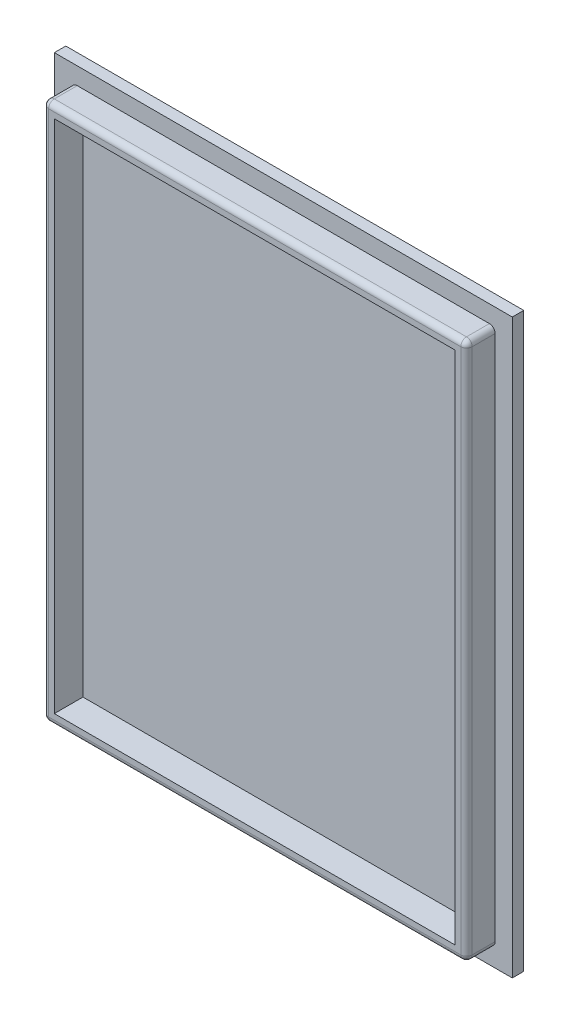
ISO-10303-21;
HEADER;
FILE_DESCRIPTION(('STEP AP214'),'2;1');
FILE_NAME('part.step','',(''),(''),'','','');
FILE_SCHEMA(('AUTOMOTIVE_DESIGN { 1 0 10303 214 1 1 1 1 }'));
ENDSEC;
DATA;
#1=APPLICATION_CONTEXT('core data for automotive mechanical design processes');
#2=APPLICATION_PROTOCOL_DEFINITION('international standard','automotive_design',2000,#1);
#3=PRODUCT_CONTEXT('',#1,'mechanical');
#4=PRODUCT('Part','Part','',(#3));
#5=PRODUCT_RELATED_PRODUCT_CATEGORY('part','',(#4));
#6=PRODUCT_DEFINITION_FORMATION('','',#4);
#7=PRODUCT_DEFINITION_CONTEXT('part definition',#1,'design');
#8=PRODUCT_DEFINITION('design','',#6,#7);
#9=PRODUCT_DEFINITION_SHAPE('','',#8);
#10=(LENGTH_UNIT() NAMED_UNIT(*) SI_UNIT(.MILLI.,.METRE.));
#11=(NAMED_UNIT(*) PLANE_ANGLE_UNIT() SI_UNIT($,.RADIAN.));
#12=(NAMED_UNIT(*) SI_UNIT($,.STERADIAN.) SOLID_ANGLE_UNIT());
#13=UNCERTAINTY_MEASURE_WITH_UNIT(LENGTH_MEASURE(1.E-05),#10,'distance_accuracy_value','');
#14=(GEOMETRIC_REPRESENTATION_CONTEXT(3) GLOBAL_UNCERTAINTY_ASSIGNED_CONTEXT((#13)) GLOBAL_UNIT_ASSIGNED_CONTEXT((#10,
#11,#12)) REPRESENTATION_CONTEXT('',''));
#15=CARTESIAN_POINT('',(0.,0.,0.));
#16=DIRECTION('',(0.,0.,1.));
#17=DIRECTION('',(1.,0.,0.));
#18=AXIS2_PLACEMENT_3D('',#15,#16,#17);
#19=CARTESIAN_POINT('',(0.,0.,2.));
#20=DIRECTION('',(0.,0.,1.));
#21=DIRECTION('',(1.,0.,0.));
#22=AXIS2_PLACEMENT_3D('',#19,#20,#21);
#23=PLANE('',#22);
#24=DIRECTION('',(0.,1.,0.));
#25=VECTOR('',#24,1.);
#26=CARTESIAN_POINT('',(40.,50.,2.));
#27=LINE('',#26,#25);
#28=CARTESIAN_POINT('',(40.,-50.,2.));
#29=VERTEX_POINT('',#28);
#30=CARTESIAN_POINT('',(40.,50.,2.));
#31=VERTEX_POINT('',#30);
#32=EDGE_CURVE('E170',#29,#31,#27,.T.);
#33=ORIENTED_EDGE('',*,*,#32,.T.);
#34=DIRECTION('',(-1.,0.,0.));
#35=VECTOR('',#34,1.);
#36=CARTESIAN_POINT('',(-40.,50.,2.));
#37=LINE('',#36,#35);
#38=CARTESIAN_POINT('',(-40.,50.,2.));
#39=VERTEX_POINT('',#38);
#40=EDGE_CURVE('E276',#31,#39,#37,.T.);
#41=ORIENTED_EDGE('',*,*,#40,.T.);
#42=DIRECTION('',(0.,-1.,0.));
#43=VECTOR('',#42,1.);
#44=CARTESIAN_POINT('',(-40.,50.,2.));
#45=LINE('',#44,#43);
#46=CARTESIAN_POINT('',(-40.,-50.,2.));
#47=VERTEX_POINT('',#46);
#48=EDGE_CURVE('E274',#39,#47,#45,.T.);
#49=ORIENTED_EDGE('',*,*,#48,.T.);
#50=DIRECTION('',(1.,0.,0.));
#51=VECTOR('',#50,1.);
#52=CARTESIAN_POINT('',(-40.,-50.,2.));
#53=LINE('',#52,#51);
#54=EDGE_CURVE('E266',#47,#29,#53,.T.);
#55=ORIENTED_EDGE('',*,*,#54,.T.);
#56=EDGE_LOOP('',(#33,#41,#49,#55));
#57=FACE_BOUND('',#56,.T.);
#58=DIRECTION('',(0.,1.,0.));
#59=VECTOR('',#58,1.);
#60=CARTESIAN_POINT('',(37.,-47.,2.));
#61=LINE('',#60,#59);
#62=CARTESIAN_POINT('',(37.,-46.,2.));
#63=VERTEX_POINT('',#62);
#64=CARTESIAN_POINT('',(37.,46.,2.));
#65=VERTEX_POINT('',#64);
#66=EDGE_CURVE('E285',#63,#65,#61,.T.);
#67=ORIENTED_EDGE('',*,*,#66,.F.);
#68=CARTESIAN_POINT('',(36.,-46.,2.));
#69=DIRECTION('',(0.,0.,1.));
#70=DIRECTION('',(1.,0.,0.));
#71=AXIS2_PLACEMENT_3D('',#68,#69,#70);
#72=CIRCLE('',#71,1.);
#73=CARTESIAN_POINT('',(36.,-47.,2.));
#74=VERTEX_POINT('',#73);
#75=EDGE_CURVE('E220',#63,#74,#72,.F.);
#76=ORIENTED_EDGE('',*,*,#75,.T.);
#77=DIRECTION('',(1.,0.,0.));
#78=VECTOR('',#77,1.);
#79=CARTESIAN_POINT('',(-37.,-47.,2.));
#80=LINE('',#79,#78);
#81=CARTESIAN_POINT('',(-36.,-47.,2.));
#82=VERTEX_POINT('',#81);
#83=EDGE_CURVE('E288',#82,#74,#80,.T.);
#84=ORIENTED_EDGE('',*,*,#83,.F.);
#85=CARTESIAN_POINT('',(-36.,-46.,2.));
#86=DIRECTION('',(0.,0.,1.));
#87=DIRECTION('',(1.,0.,0.));
#88=AXIS2_PLACEMENT_3D('',#85,#86,#87);
#89=CIRCLE('',#88,1.);
#90=CARTESIAN_POINT('',(-37.,-46.,2.));
#91=VERTEX_POINT('',#90);
#92=EDGE_CURVE('E222',#82,#91,#89,.F.);
#93=ORIENTED_EDGE('',*,*,#92,.T.);
#94=DIRECTION('',(0.,-1.,0.));
#95=VECTOR('',#94,1.);
#96=CARTESIAN_POINT('',(-37.,47.,2.));
#97=LINE('',#96,#95);
#98=CARTESIAN_POINT('',(-37.,46.,2.));
#99=VERTEX_POINT('',#98);
#100=EDGE_CURVE('E272',#99,#91,#97,.T.);
#101=ORIENTED_EDGE('',*,*,#100,.F.);
#102=CARTESIAN_POINT('',(-36.,46.,2.));
#103=DIRECTION('',(0.,0.,1.));
#104=DIRECTION('',(1.,0.,0.));
#105=AXIS2_PLACEMENT_3D('',#102,#103,#104);
#106=CIRCLE('',#105,1.);
#107=CARTESIAN_POINT('',(-36.,47.,2.));
#108=VERTEX_POINT('',#107);
#109=EDGE_CURVE('E179',#99,#108,#106,.F.);
#110=ORIENTED_EDGE('',*,*,#109,.T.);
#111=DIRECTION('',(-1.,0.,0.));
#112=VECTOR('',#111,1.);
#113=CARTESIAN_POINT('',(37.,47.,2.));
#114=LINE('',#113,#112);
#115=CARTESIAN_POINT('',(36.,47.,2.));
#116=VERTEX_POINT('',#115);
#117=EDGE_CURVE('E282',#116,#108,#114,.T.);
#118=ORIENTED_EDGE('',*,*,#117,.F.);
#119=CARTESIAN_POINT('',(36.,46.,2.));
#120=DIRECTION('',(0.,0.,1.));
#121=DIRECTION('',(1.,0.,0.));
#122=AXIS2_PLACEMENT_3D('',#119,#120,#121);
#123=CIRCLE('',#122,1.);
#124=EDGE_CURVE('E181',#116,#65,#123,.F.);
#125=ORIENTED_EDGE('',*,*,#124,.T.);
#126=EDGE_LOOP('',(#67,#76,#84,#93,#101,#110,#118,#125));
#127=FACE_BOUND('',#126,.T.);
#128=ADVANCED_FACE('F33',(#57,#127),#23,.T.);
#129=CARTESIAN_POINT('',(40.,50.,2.));
#130=DIRECTION('',(-1.,0.,0.));
#131=DIRECTION('',(0.,-1.,0.));
#132=AXIS2_PLACEMENT_3D('',#129,#130,#131);
#133=PLANE('',#132);
#134=DIRECTION('',(0.,1.,0.));
#135=VECTOR('',#134,1.);
#136=CARTESIAN_POINT('',(40.,50.,0.));
#137=LINE('',#136,#135);
#138=CARTESIAN_POINT('',(40.,-50.,0.));
#139=VERTEX_POINT('',#138);
#140=CARTESIAN_POINT('',(40.,50.,0.));
#141=VERTEX_POINT('',#140);
#142=EDGE_CURVE('E166',#139,#141,#137,.T.);
#143=ORIENTED_EDGE('',*,*,#142,.T.);
#144=DIRECTION('',(0.,0.,-1.));
#145=VECTOR('',#144,1.);
#146=CARTESIAN_POINT('',(40.,50.,2.));
#147=LINE('',#146,#145);
#148=EDGE_CURVE('E258',#31,#141,#147,.T.);
#149=ORIENTED_EDGE('',*,*,#148,.F.);
#150=ORIENTED_EDGE('',*,*,#32,.F.);
#151=DIRECTION('',(0.,0.,-1.));
#152=VECTOR('',#151,1.);
#153=CARTESIAN_POINT('',(40.,-50.,2.));
#154=LINE('',#153,#152);
#155=EDGE_CURVE('E265',#29,#139,#154,.T.);
#156=ORIENTED_EDGE('',*,*,#155,.T.);
#157=EDGE_LOOP('',(#143,#149,#150,#156));
#158=FACE_BOUND('',#157,.T.);
#159=ADVANCED_FACE('F351',(#158),#133,.F.);
#160=CARTESIAN_POINT('',(-40.,50.,2.));
#161=DIRECTION('',(0.,-1.,0.));
#162=DIRECTION('',(0.,0.,-1.));
#163=AXIS2_PLACEMENT_3D('',#160,#161,#162);
#164=PLANE('',#163);
#165=DIRECTION('',(-1.,0.,0.));
#166=VECTOR('',#165,1.);
#167=CARTESIAN_POINT('',(-40.,50.,0.));
#168=LINE('',#167,#166);
#169=CARTESIAN_POINT('',(-40.,50.,0.));
#170=VERTEX_POINT('',#169);
#171=EDGE_CURVE('E269',#141,#170,#168,.T.);
#172=ORIENTED_EDGE('',*,*,#171,.T.);
#173=DIRECTION('',(0.,0.,-1.));
#174=VECTOR('',#173,1.);
#175=CARTESIAN_POINT('',(-40.,50.,2.));
#176=LINE('',#175,#174);
#177=EDGE_CURVE('E261',#39,#170,#176,.T.);
#178=ORIENTED_EDGE('',*,*,#177,.F.);
#179=ORIENTED_EDGE('',*,*,#40,.F.);
#180=ORIENTED_EDGE('',*,*,#148,.T.);
#181=EDGE_LOOP('',(#172,#178,#179,#180));
#182=FACE_BOUND('',#181,.T.);
#183=ADVANCED_FACE('F356',(#182),#164,.F.);
#184=CARTESIAN_POINT('',(-40.,50.,2.));
#185=DIRECTION('',(1.,0.,0.));
#186=DIRECTION('',(0.,1.,0.));
#187=AXIS2_PLACEMENT_3D('',#184,#185,#186);
#188=PLANE('',#187);
#189=DIRECTION('',(0.,0.707106781186548,-0.707106781186547));
#190=VECTOR('',#189,1.);
#191=CARTESIAN_POINT('',(-40.,-0.249999999999938,-48.25));
#192=LINE('',#191,#190);
#193=CARTESIAN_POINT('',(-40.,-50.,1.49999999999998));
#194=VERTEX_POINT('',#193);
#195=CARTESIAN_POINT('',(-40.,-48.5,0.));
#196=VERTEX_POINT('',#195);
#197=EDGE_CURVE('E48',#194,#196,#192,.T.);
#198=ORIENTED_EDGE('',*,*,#197,.F.);
#199=DIRECTION('',(0.,0.,-1.));
#200=VECTOR('',#199,1.);
#201=CARTESIAN_POINT('',(-40.,-50.,2.));
#202=LINE('',#201,#200);
#203=EDGE_CURVE('E176',#47,#194,#202,.T.);
#204=ORIENTED_EDGE('',*,*,#203,.F.);
#205=ORIENTED_EDGE('',*,*,#48,.F.);
#206=ORIENTED_EDGE('',*,*,#177,.T.);
#207=DIRECTION('',(0.,-1.,0.));
#208=VECTOR('',#207,1.);
#209=CARTESIAN_POINT('',(-40.,50.,0.));
#210=LINE('',#209,#208);
#211=EDGE_CURVE('E171',#170,#196,#210,.T.);
#212=ORIENTED_EDGE('',*,*,#211,.T.);
#213=EDGE_LOOP('',(#198,#204,#205,#206,#212));
#214=FACE_BOUND('',#213,.T.);
#215=ADVANCED_FACE('F368',(#214),#188,.F.);
#216=CARTESIAN_POINT('',(-40.,-50.,2.));
#217=DIRECTION('',(0.,1.,0.));
#218=DIRECTION('',(0.,0.,1.));
#219=AXIS2_PLACEMENT_3D('',#216,#217,#218);
#220=PLANE('',#219);
#221=DIRECTION('',(-0.707106781186548,0.,0.707106781186547));
#222=VECTOR('',#221,1.);
#223=CARTESIAN_POINT('',(-40.25,-50.,1.74999999999999));
#224=LINE('',#223,#222);
#225=CARTESIAN_POINT('',(-38.5,-50.,0.));
#226=VERTEX_POINT('',#225);
#227=EDGE_CURVE('E41',#226,#194,#224,.T.);
#228=ORIENTED_EDGE('',*,*,#227,.F.);
#229=DIRECTION('',(1.,0.,0.));
#230=VECTOR('',#229,1.);
#231=CARTESIAN_POINT('',(-40.,-50.,0.));
#232=LINE('',#231,#230);
#233=EDGE_CURVE('E162',#226,#139,#232,.T.);
#234=ORIENTED_EDGE('',*,*,#233,.T.);
#235=ORIENTED_EDGE('',*,*,#155,.F.);
#236=ORIENTED_EDGE('',*,*,#54,.F.);
#237=ORIENTED_EDGE('',*,*,#203,.T.);
#238=EDGE_LOOP('',(#228,#234,#235,#236,#237));
#239=FACE_BOUND('',#238,.T.);
#240=ADVANCED_FACE('F174',(#239),#220,.F.);
#241=CARTESIAN_POINT('',(0.,0.,0.));
#242=DIRECTION('',(0.,0.,1.));
#243=DIRECTION('',(1.,0.,0.));
#244=AXIS2_PLACEMENT_3D('',#241,#242,#243);
#245=PLANE('',#244);
#246=DIRECTION('',(0.707106781186548,-0.707106781186548,0.));
#247=VECTOR('',#246,1.);
#248=CARTESIAN_POINT('',(-44.25,-44.25,0.));
#249=LINE('',#248,#247);
#250=EDGE_CURVE('E11',#196,#226,#249,.T.);
#251=ORIENTED_EDGE('',*,*,#250,.F.);
#252=ORIENTED_EDGE('',*,*,#211,.F.);
#253=ORIENTED_EDGE('',*,*,#171,.F.);
#254=ORIENTED_EDGE('',*,*,#142,.F.);
#255=ORIENTED_EDGE('',*,*,#233,.F.);
#256=EDGE_LOOP('',(#251,#252,#253,#254,#255));
#257=FACE_BOUND('',#256,.T.);
#258=ADVANCED_FACE('F164',(#257),#245,.F.);
#259=CARTESIAN_POINT('',(0.,0.,7.));
#260=DIRECTION('',(0.,0.,1.));
#261=DIRECTION('',(1.,0.,0.));
#262=AXIS2_PLACEMENT_3D('',#259,#260,#261);
#263=PLANE('',#262);
#264=DIRECTION('',(0.,1.,0.));
#265=VECTOR('',#264,1.);
#266=CARTESIAN_POINT('',(36.,47.,7.));
#267=LINE('',#266,#265);
#268=CARTESIAN_POINT('',(36.,-46.,7.));
#269=VERTEX_POINT('',#268);
#270=CARTESIAN_POINT('',(36.,46.,7.));
#271=VERTEX_POINT('',#270);
#272=EDGE_CURVE('E252',#269,#271,#267,.T.);
#273=ORIENTED_EDGE('',*,*,#272,.T.);
#274=DIRECTION('',(-1.,0.,0.));
#275=VECTOR('',#274,1.);
#276=CARTESIAN_POINT('',(-37.,46.,7.));
#277=LINE('',#276,#275);
#278=CARTESIAN_POINT('',(-36.,46.,7.));
#279=VERTEX_POINT('',#278);
#280=EDGE_CURVE('E249',#271,#279,#277,.T.);
#281=ORIENTED_EDGE('',*,*,#280,.T.);
#282=DIRECTION('',(0.,-1.,0.));
#283=VECTOR('',#282,1.);
#284=CARTESIAN_POINT('',(-36.,-47.,7.));
#285=LINE('',#284,#283);
#286=CARTESIAN_POINT('',(-36.,-46.,7.));
#287=VERTEX_POINT('',#286);
#288=EDGE_CURVE('E256',#279,#287,#285,.T.);
#289=ORIENTED_EDGE('',*,*,#288,.T.);
#290=DIRECTION('',(1.,0.,0.));
#291=VECTOR('',#290,1.);
#292=CARTESIAN_POINT('',(37.,-46.,7.));
#293=LINE('',#292,#291);
#294=EDGE_CURVE('E254',#287,#269,#293,.T.);
#295=ORIENTED_EDGE('',*,*,#294,.T.);
#296=EDGE_LOOP('',(#273,#281,#289,#295));
#297=FACE_BOUND('',#296,.T.);
#298=DIRECTION('',(0.,-1.,0.));
#299=VECTOR('',#298,1.);
#300=CARTESIAN_POINT('',(-35.,45.,7.));
#301=LINE('',#300,#299);
#302=CARTESIAN_POINT('',(-35.,45.,7.));
#303=VERTEX_POINT('',#302);
#304=CARTESIAN_POINT('',(-35.,-45.,7.));
#305=VERTEX_POINT('',#304);
#306=EDGE_CURVE('E316',#303,#305,#301,.T.);
#307=ORIENTED_EDGE('',*,*,#306,.F.);
#308=DIRECTION('',(-1.,0.,0.));
#309=VECTOR('',#308,1.);
#310=CARTESIAN_POINT('',(35.,45.,7.));
#311=LINE('',#310,#309);
#312=CARTESIAN_POINT('',(35.,45.,7.));
#313=VERTEX_POINT('',#312);
#314=EDGE_CURVE('E306',#313,#303,#311,.T.);
#315=ORIENTED_EDGE('',*,*,#314,.F.);
#316=DIRECTION('',(0.,1.,0.));
#317=VECTOR('',#316,1.);
#318=CARTESIAN_POINT('',(35.,-45.,7.));
#319=LINE('',#318,#317);
#320=CARTESIAN_POINT('',(35.,-45.,7.));
#321=VERTEX_POINT('',#320);
#322=EDGE_CURVE('E303',#321,#313,#319,.T.);
#323=ORIENTED_EDGE('',*,*,#322,.F.);
#324=DIRECTION('',(1.,0.,0.));
#325=VECTOR('',#324,1.);
#326=CARTESIAN_POINT('',(-35.,-45.,7.));
#327=LINE('',#326,#325);
#328=EDGE_CURVE('E313',#305,#321,#327,.T.);
#329=ORIENTED_EDGE('',*,*,#328,.F.);
#330=EDGE_LOOP('',(#307,#315,#323,#329));
#331=FACE_BOUND('',#330,.T.);
#332=ADVANCED_FACE('F332',(#297,#331),#263,.T.);
#333=CARTESIAN_POINT('',(-37.,-47.,7.));
#334=DIRECTION('',(0.,1.,0.));
#335=DIRECTION('',(0.,0.,1.));
#336=AXIS2_PLACEMENT_3D('',#333,#334,#335);
#337=PLANE('',#336);
#338=DIRECTION('',(1.,0.,0.));
#339=VECTOR('',#338,1.);
#340=CARTESIAN_POINT('',(-37.,-47.,6.));
#341=LINE('',#340,#339);
#342=CARTESIAN_POINT('',(36.,-47.,6.));
#343=VERTEX_POINT('',#342);
#344=CARTESIAN_POINT('',(-36.,-47.,6.));
#345=VERTEX_POINT('',#344);
#346=EDGE_CURVE('E232',#343,#345,#341,.F.);
#347=ORIENTED_EDGE('',*,*,#346,.T.);
#348=DIRECTION('',(0.,0.,-1.));
#349=VECTOR('',#348,1.);
#350=CARTESIAN_POINT('',(-36.,-47.,7.));
#351=LINE('',#350,#349);
#352=EDGE_CURVE('E230',#345,#82,#351,.T.);
#353=ORIENTED_EDGE('',*,*,#352,.T.);
#354=ORIENTED_EDGE('',*,*,#83,.T.);
#355=DIRECTION('',(0.,0.,-1.));
#356=VECTOR('',#355,1.);
#357=CARTESIAN_POINT('',(36.,-47.,7.));
#358=LINE('',#357,#356);
#359=EDGE_CURVE('E234',#74,#343,#358,.F.);
#360=ORIENTED_EDGE('',*,*,#359,.T.);
#361=EDGE_LOOP('',(#347,#353,#354,#360));
#362=FACE_BOUND('',#361,.T.);
#363=ADVANCED_FACE('F362',(#362),#337,.F.);
#364=CARTESIAN_POINT('',(37.,-47.,7.));
#365=DIRECTION('',(-1.,0.,0.));
#366=DIRECTION('',(0.,-1.,0.));
#367=AXIS2_PLACEMENT_3D('',#364,#365,#366);
#368=PLANE('',#367);
#369=DIRECTION('',(0.,1.,0.));
#370=VECTOR('',#369,1.);
#371=CARTESIAN_POINT('',(37.,-47.,6.));
#372=LINE('',#371,#370);
#373=CARTESIAN_POINT('',(37.,46.,6.));
#374=VERTEX_POINT('',#373);
#375=CARTESIAN_POINT('',(37.,-46.,6.));
#376=VERTEX_POINT('',#375);
#377=EDGE_CURVE('E238',#374,#376,#372,.F.);
#378=ORIENTED_EDGE('',*,*,#377,.T.);
#379=DIRECTION('',(0.,0.,-1.));
#380=VECTOR('',#379,1.);
#381=CARTESIAN_POINT('',(37.,-46.,7.));
#382=LINE('',#381,#380);
#383=EDGE_CURVE('E236',#376,#63,#382,.T.);
#384=ORIENTED_EDGE('',*,*,#383,.T.);
#385=ORIENTED_EDGE('',*,*,#66,.T.);
#386=DIRECTION('',(0.,0.,-1.));
#387=VECTOR('',#386,1.);
#388=CARTESIAN_POINT('',(37.,46.,7.));
#389=LINE('',#388,#387);
#390=EDGE_CURVE('E240',#65,#374,#389,.F.);
#391=ORIENTED_EDGE('',*,*,#390,.T.);
#392=EDGE_LOOP('',(#378,#384,#385,#391));
#393=FACE_BOUND('',#392,.T.);
#394=ADVANCED_FACE('F462',(#393),#368,.F.);
#395=CARTESIAN_POINT('',(37.,47.,7.));
#396=DIRECTION('',(0.,-1.,0.));
#397=DIRECTION('',(0.,0.,-1.));
#398=AXIS2_PLACEMENT_3D('',#395,#396,#397);
#399=PLANE('',#398);
#400=DIRECTION('',(-1.,0.,0.));
#401=VECTOR('',#400,1.);
#402=CARTESIAN_POINT('',(37.,47.,6.));
#403=LINE('',#402,#401);
#404=CARTESIAN_POINT('',(-36.,47.,6.));
#405=VERTEX_POINT('',#404);
#406=CARTESIAN_POINT('',(36.,47.,6.));
#407=VERTEX_POINT('',#406);
#408=EDGE_CURVE('E244',#405,#407,#403,.F.);
#409=ORIENTED_EDGE('',*,*,#408,.T.);
#410=DIRECTION('',(0.,0.,-1.));
#411=VECTOR('',#410,1.);
#412=CARTESIAN_POINT('',(36.,47.,7.));
#413=LINE('',#412,#411);
#414=EDGE_CURVE('E242',#407,#116,#413,.T.);
#415=ORIENTED_EDGE('',*,*,#414,.T.);
#416=ORIENTED_EDGE('',*,*,#117,.T.);
#417=DIRECTION('',(0.,0.,-1.));
#418=VECTOR('',#417,1.);
#419=CARTESIAN_POINT('',(-36.,47.,7.));
#420=LINE('',#419,#418);
#421=EDGE_CURVE('E247',#108,#405,#420,.F.);
#422=ORIENTED_EDGE('',*,*,#421,.T.);
#423=EDGE_LOOP('',(#409,#415,#416,#422));
#424=FACE_BOUND('',#423,.T.);
#425=ADVANCED_FACE('F457',(#424),#399,.F.);
#426=CARTESIAN_POINT('',(-37.,47.,7.));
#427=DIRECTION('',(1.,0.,0.));
#428=DIRECTION('',(0.,1.,0.));
#429=AXIS2_PLACEMENT_3D('',#426,#427,#428);
#430=PLANE('',#429);
#431=ORIENTED_EDGE('',*,*,#100,.T.);
#432=DIRECTION('',(0.,0.,-1.));
#433=VECTOR('',#432,1.);
#434=CARTESIAN_POINT('',(-37.,-46.,7.));
#435=LINE('',#434,#433);
#436=CARTESIAN_POINT('',(-37.,-46.,6.));
#437=VERTEX_POINT('',#436);
#438=EDGE_CURVE('E224',#91,#437,#435,.F.);
#439=ORIENTED_EDGE('',*,*,#438,.T.);
#440=DIRECTION('',(0.,-1.,0.));
#441=VECTOR('',#440,1.);
#442=CARTESIAN_POINT('',(-37.,47.,6.));
#443=LINE('',#442,#441);
#444=CARTESIAN_POINT('',(-37.,46.,6.));
#445=VERTEX_POINT('',#444);
#446=EDGE_CURVE('E226',#437,#445,#443,.F.);
#447=ORIENTED_EDGE('',*,*,#446,.T.);
#448=DIRECTION('',(0.,0.,-1.));
#449=VECTOR('',#448,1.);
#450=CARTESIAN_POINT('',(-37.,46.,7.));
#451=LINE('',#450,#449);
#452=EDGE_CURVE('E228',#445,#99,#451,.T.);
#453=ORIENTED_EDGE('',*,*,#452,.T.);
#454=EDGE_LOOP('',(#431,#439,#447,#453));
#455=FACE_BOUND('',#454,.T.);
#456=ADVANCED_FACE('F449',(#455),#430,.F.);
#457=CARTESIAN_POINT('',(35.,45.,7.));
#458=DIRECTION('',(0.,-1.,0.));
#459=DIRECTION('',(0.,0.,-1.));
#460=AXIS2_PLACEMENT_3D('',#457,#458,#459);
#461=PLANE('',#460);
#462=DIRECTION('',(-1.,0.,0.));
#463=VECTOR('',#462,1.);
#464=CARTESIAN_POINT('',(35.,45.,2.));
#465=LINE('',#464,#463);
#466=CARTESIAN_POINT('',(35.,45.,2.));
#467=VERTEX_POINT('',#466);
#468=CARTESIAN_POINT('',(-35.,45.,2.));
#469=VERTEX_POINT('',#468);
#470=EDGE_CURVE('E187',#467,#469,#465,.T.);
#471=ORIENTED_EDGE('',*,*,#470,.F.);
#472=DIRECTION('',(0.,0.,-1.));
#473=VECTOR('',#472,1.);
#474=CARTESIAN_POINT('',(35.,45.,7.));
#475=LINE('',#474,#473);
#476=EDGE_CURVE('E300',#313,#467,#475,.T.);
#477=ORIENTED_EDGE('',*,*,#476,.F.);
#478=ORIENTED_EDGE('',*,*,#314,.T.);
#479=DIRECTION('',(0.,0.,-1.));
#480=VECTOR('',#479,1.);
#481=CARTESIAN_POINT('',(-35.,45.,7.));
#482=LINE('',#481,#480);
#483=EDGE_CURVE('E291',#303,#469,#482,.T.);
#484=ORIENTED_EDGE('',*,*,#483,.T.);
#485=EDGE_LOOP('',(#471,#477,#478,#484));
#486=FACE_BOUND('',#485,.T.);
#487=ADVANCED_FACE('F323',(#486),#461,.T.);
#488=CARTESIAN_POINT('',(-35.,45.,7.));
#489=DIRECTION('',(1.,0.,0.));
#490=DIRECTION('',(0.,0.,-1.));
#491=AXIS2_PLACEMENT_3D('',#488,#489,#490);
#492=PLANE('',#491);
#493=DIRECTION('',(0.,-1.,0.));
#494=VECTOR('',#493,1.);
#495=CARTESIAN_POINT('',(-35.,45.,2.));
#496=LINE('',#495,#494);
#497=CARTESIAN_POINT('',(-35.,-45.,2.));
#498=VERTEX_POINT('',#497);
#499=EDGE_CURVE('E309',#469,#498,#496,.T.);
#500=ORIENTED_EDGE('',*,*,#499,.F.);
#501=ORIENTED_EDGE('',*,*,#483,.F.);
#502=ORIENTED_EDGE('',*,*,#306,.T.);
#503=DIRECTION('',(0.,0.,-1.));
#504=VECTOR('',#503,1.);
#505=CARTESIAN_POINT('',(-35.,-45.,7.));
#506=LINE('',#505,#504);
#507=EDGE_CURVE('E294',#305,#498,#506,.T.);
#508=ORIENTED_EDGE('',*,*,#507,.T.);
#509=EDGE_LOOP('',(#500,#501,#502,#508));
#510=FACE_BOUND('',#509,.T.);
#511=ADVANCED_FACE('F329',(#510),#492,.T.);
#512=CARTESIAN_POINT('',(-35.,-45.,7.));
#513=DIRECTION('',(0.,1.,0.));
#514=DIRECTION('',(0.,0.,1.));
#515=AXIS2_PLACEMENT_3D('',#512,#513,#514);
#516=PLANE('',#515);
#517=DIRECTION('',(1.,0.,0.));
#518=VECTOR('',#517,1.);
#519=CARTESIAN_POINT('',(-35.,-45.,2.));
#520=LINE('',#519,#518);
#521=CARTESIAN_POINT('',(35.,-45.,2.));
#522=VERTEX_POINT('',#521);
#523=EDGE_CURVE('E307',#498,#522,#520,.T.);
#524=ORIENTED_EDGE('',*,*,#523,.F.);
#525=ORIENTED_EDGE('',*,*,#507,.F.);
#526=ORIENTED_EDGE('',*,*,#328,.T.);
#527=DIRECTION('',(0.,0.,-1.));
#528=VECTOR('',#527,1.);
#529=CARTESIAN_POINT('',(35.,-45.,7.));
#530=LINE('',#529,#528);
#531=EDGE_CURVE('E297',#321,#522,#530,.T.);
#532=ORIENTED_EDGE('',*,*,#531,.T.);
#533=EDGE_LOOP('',(#524,#525,#526,#532));
#534=FACE_BOUND('',#533,.T.);
#535=ADVANCED_FACE('F335',(#534),#516,.T.);
#536=CARTESIAN_POINT('',(35.,-45.,7.));
#537=DIRECTION('',(-1.,0.,0.));
#538=DIRECTION('',(0.,0.,1.));
#539=AXIS2_PLACEMENT_3D('',#536,#537,#538);
#540=PLANE('',#539);
#541=DIRECTION('',(0.,1.,0.));
#542=VECTOR('',#541,1.);
#543=CARTESIAN_POINT('',(35.,-45.,2.));
#544=LINE('',#543,#542);
#545=EDGE_CURVE('E304',#522,#467,#544,.T.);
#546=ORIENTED_EDGE('',*,*,#545,.F.);
#547=ORIENTED_EDGE('',*,*,#531,.F.);
#548=ORIENTED_EDGE('',*,*,#322,.T.);
#549=ORIENTED_EDGE('',*,*,#476,.T.);
#550=EDGE_LOOP('',(#546,#547,#548,#549));
#551=FACE_BOUND('',#550,.T.);
#552=ADVANCED_FACE('F340',(#551),#540,.T.);
#553=ORIENTED_EDGE('',*,*,#470,.T.);
#554=ORIENTED_EDGE('',*,*,#499,.T.);
#555=ORIENTED_EDGE('',*,*,#523,.T.);
#556=ORIENTED_EDGE('',*,*,#545,.T.);
#557=EDGE_LOOP('',(#553,#554,#555,#556));
#558=FACE_BOUND('',#557,.T.);
#559=ADVANCED_FACE('F338',(#558),#23,.T.);
#560=CARTESIAN_POINT('',(36.,-46.,7.));
#561=DIRECTION('',(0.,0.,-1.));
#562=DIRECTION('',(-1.,0.,0.));
#563=AXIS2_PLACEMENT_3D('',#560,#561,#562);
#564=CYLINDRICAL_SURFACE('',#563,1.);
#565=ORIENTED_EDGE('',*,*,#75,.F.);
#566=ORIENTED_EDGE('',*,*,#383,.F.);
#567=CARTESIAN_POINT('',(36.,-46.,6.));
#568=DIRECTION('',(0.,0.,1.));
#569=DIRECTION('',(1.,0.,0.));
#570=AXIS2_PLACEMENT_3D('',#567,#568,#569);
#571=CIRCLE('',#570,1.);
#572=EDGE_CURVE('E184',#343,#376,#571,.T.);
#573=ORIENTED_EDGE('',*,*,#572,.F.);
#574=ORIENTED_EDGE('',*,*,#359,.F.);
#575=EDGE_LOOP('',(#565,#566,#573,#574));
#576=FACE_BOUND('',#575,.T.);
#577=ADVANCED_FACE('F35',(#576),#564,.T.);
#578=CARTESIAN_POINT('',(0.,-46.,6.));
#579=DIRECTION('',(-1.,0.,0.));
#580=DIRECTION('',(0.,0.,1.));
#581=AXIS2_PLACEMENT_3D('',#578,#579,#580);
#582=CYLINDRICAL_SURFACE('',#581,1.);
#583=CARTESIAN_POINT('',(-36.,-46.,6.));
#584=DIRECTION('',(-1.,0.,0.));
#585=DIRECTION('',(0.,0.,1.));
#586=AXIS2_PLACEMENT_3D('',#583,#584,#585);
#587=CIRCLE('',#586,1.);
#588=EDGE_CURVE('E191',#345,#287,#587,.T.);
#589=ORIENTED_EDGE('',*,*,#588,.F.);
#590=ORIENTED_EDGE('',*,*,#346,.F.);
#591=CARTESIAN_POINT('',(36.,-46.,6.));
#592=DIRECTION('',(1.,0.,0.));
#593=DIRECTION('',(0.,0.,-1.));
#594=AXIS2_PLACEMENT_3D('',#591,#592,#593);
#595=CIRCLE('',#594,1.);
#596=EDGE_CURVE('E188',#269,#343,#595,.T.);
#597=ORIENTED_EDGE('',*,*,#596,.F.);
#598=ORIENTED_EDGE('',*,*,#294,.F.);
#599=EDGE_LOOP('',(#589,#590,#597,#598));
#600=FACE_BOUND('',#599,.T.);
#601=ADVANCED_FACE('F412',(#600),#582,.T.);
#602=CARTESIAN_POINT('',(-36.,-46.,7.));
#603=DIRECTION('',(0.,0.,-1.));
#604=DIRECTION('',(-1.,0.,0.));
#605=AXIS2_PLACEMENT_3D('',#602,#603,#604);
#606=CYLINDRICAL_SURFACE('',#605,1.);
#607=ORIENTED_EDGE('',*,*,#92,.F.);
#608=ORIENTED_EDGE('',*,*,#352,.F.);
#609=CARTESIAN_POINT('',(-36.,-46.,6.));
#610=DIRECTION('',(0.,0.,1.));
#611=DIRECTION('',(1.,0.,0.));
#612=AXIS2_PLACEMENT_3D('',#609,#610,#611);
#613=CIRCLE('',#612,1.);
#614=EDGE_CURVE('E194',#437,#345,#613,.T.);
#615=ORIENTED_EDGE('',*,*,#614,.F.);
#616=ORIENTED_EDGE('',*,*,#438,.F.);
#617=EDGE_LOOP('',(#607,#608,#615,#616));
#618=FACE_BOUND('',#617,.T.);
#619=ADVANCED_FACE('F409',(#618),#606,.T.);
#620=CARTESIAN_POINT('',(36.,-46.,6.));
#621=DIRECTION('',(0.,0.,1.));
#622=DIRECTION('',(1.,0.,0.));
#623=AXIS2_PLACEMENT_3D('',#620,#621,#622);
#624=SPHERICAL_SURFACE('',#623,1.);
#625=ORIENTED_EDGE('',*,*,#596,.T.);
#626=ORIENTED_EDGE('',*,*,#572,.T.);
#627=CARTESIAN_POINT('',(36.,-46.,6.));
#628=DIRECTION('',(0.,-1.,0.));
#629=DIRECTION('',(0.,0.,-1.));
#630=AXIS2_PLACEMENT_3D('',#627,#628,#629);
#631=CIRCLE('',#630,1.);
#632=EDGE_CURVE('E197',#269,#376,#631,.F.);
#633=ORIENTED_EDGE('',*,*,#632,.F.);
#634=EDGE_LOOP('',(#625,#626,#633));
#635=FACE_BOUND('',#634,.T.);
#636=ADVANCED_FACE('F405',(#635),#624,.T.);
#637=CARTESIAN_POINT('',(-36.,-46.,6.));
#638=DIRECTION('',(0.,0.,1.));
#639=DIRECTION('',(1.,0.,0.));
#640=AXIS2_PLACEMENT_3D('',#637,#638,#639);
#641=SPHERICAL_SURFACE('',#640,1.);
#642=ORIENTED_EDGE('',*,*,#614,.T.);
#643=ORIENTED_EDGE('',*,*,#588,.T.);
#644=CARTESIAN_POINT('',(-36.,-46.,6.));
#645=DIRECTION('',(0.,-1.,0.));
#646=DIRECTION('',(0.,0.,-1.));
#647=AXIS2_PLACEMENT_3D('',#644,#645,#646);
#648=CIRCLE('',#647,1.);
#649=EDGE_CURVE('E200',#437,#287,#648,.F.);
#650=ORIENTED_EDGE('',*,*,#649,.F.);
#651=EDGE_LOOP('',(#642,#643,#650));
#652=FACE_BOUND('',#651,.T.);
#653=ADVANCED_FACE('F401',(#652),#641,.T.);
#654=CARTESIAN_POINT('',(36.,46.,7.));
#655=DIRECTION('',(0.,0.,-1.));
#656=DIRECTION('',(-1.,0.,0.));
#657=AXIS2_PLACEMENT_3D('',#654,#655,#656);
#658=CYLINDRICAL_SURFACE('',#657,1.);
#659=ORIENTED_EDGE('',*,*,#124,.F.);
#660=ORIENTED_EDGE('',*,*,#414,.F.);
#661=CARTESIAN_POINT('',(36.,46.,6.));
#662=DIRECTION('',(0.,0.,1.));
#663=DIRECTION('',(1.,0.,0.));
#664=AXIS2_PLACEMENT_3D('',#661,#662,#663);
#665=CIRCLE('',#664,1.);
#666=EDGE_CURVE('E203',#374,#407,#665,.T.);
#667=ORIENTED_EDGE('',*,*,#666,.F.);
#668=ORIENTED_EDGE('',*,*,#390,.F.);
#669=EDGE_LOOP('',(#659,#660,#667,#668));
#670=FACE_BOUND('',#669,.T.);
#671=ADVANCED_FACE('F397',(#670),#658,.T.);
#672=CARTESIAN_POINT('',(36.,0.,6.));
#673=DIRECTION('',(0.,-1.,0.));
#674=DIRECTION('',(1.,0.,0.));
#675=AXIS2_PLACEMENT_3D('',#672,#673,#674);
#676=CYLINDRICAL_SURFACE('',#675,1.);
#677=ORIENTED_EDGE('',*,*,#632,.T.);
#678=ORIENTED_EDGE('',*,*,#377,.F.);
#679=CARTESIAN_POINT('',(36.,46.,6.));
#680=DIRECTION('',(0.,1.,0.));
#681=DIRECTION('',(0.,0.,1.));
#682=AXIS2_PLACEMENT_3D('',#679,#680,#681);
#683=CIRCLE('',#682,1.);
#684=EDGE_CURVE('E206',#271,#374,#683,.T.);
#685=ORIENTED_EDGE('',*,*,#684,.F.);
#686=ORIENTED_EDGE('',*,*,#272,.F.);
#687=EDGE_LOOP('',(#677,#678,#685,#686));
#688=FACE_BOUND('',#687,.T.);
#689=ADVANCED_FACE('F393',(#688),#676,.T.);
#690=CARTESIAN_POINT('',(-36.,0.,6.));
#691=DIRECTION('',(0.,1.,0.));
#692=DIRECTION('',(-1.,0.,0.));
#693=AXIS2_PLACEMENT_3D('',#690,#691,#692);
#694=CYLINDRICAL_SURFACE('',#693,1.);
#695=ORIENTED_EDGE('',*,*,#649,.T.);
#696=ORIENTED_EDGE('',*,*,#288,.F.);
#697=CARTESIAN_POINT('',(-36.,46.,6.));
#698=DIRECTION('',(0.,1.,0.));
#699=DIRECTION('',(0.,0.,1.));
#700=AXIS2_PLACEMENT_3D('',#697,#698,#699);
#701=CIRCLE('',#700,1.);
#702=EDGE_CURVE('E209',#445,#279,#701,.T.);
#703=ORIENTED_EDGE('',*,*,#702,.F.);
#704=ORIENTED_EDGE('',*,*,#446,.F.);
#705=EDGE_LOOP('',(#695,#696,#703,#704));
#706=FACE_BOUND('',#705,.T.);
#707=ADVANCED_FACE('F389',(#706),#694,.T.);
#708=CARTESIAN_POINT('',(-36.,46.,7.));
#709=DIRECTION('',(0.,0.,-1.));
#710=DIRECTION('',(-1.,0.,0.));
#711=AXIS2_PLACEMENT_3D('',#708,#709,#710);
#712=CYLINDRICAL_SURFACE('',#711,1.);
#713=ORIENTED_EDGE('',*,*,#109,.F.);
#714=ORIENTED_EDGE('',*,*,#452,.F.);
#715=CARTESIAN_POINT('',(-36.,46.,6.));
#716=DIRECTION('',(0.,0.,1.));
#717=DIRECTION('',(1.,0.,0.));
#718=AXIS2_PLACEMENT_3D('',#715,#716,#717);
#719=CIRCLE('',#718,1.);
#720=EDGE_CURVE('E212',#405,#445,#719,.T.);
#721=ORIENTED_EDGE('',*,*,#720,.F.);
#722=ORIENTED_EDGE('',*,*,#421,.F.);
#723=EDGE_LOOP('',(#713,#714,#721,#722));
#724=FACE_BOUND('',#723,.T.);
#725=ADVANCED_FACE('F385',(#724),#712,.T.);
#726=CARTESIAN_POINT('',(36.,46.,6.));
#727=DIRECTION('',(0.,0.,1.));
#728=DIRECTION('',(1.,0.,0.));
#729=AXIS2_PLACEMENT_3D('',#726,#727,#728);
#730=SPHERICAL_SURFACE('',#729,1.);
#731=ORIENTED_EDGE('',*,*,#684,.T.);
#732=ORIENTED_EDGE('',*,*,#666,.T.);
#733=CARTESIAN_POINT('',(36.,46.,6.));
#734=DIRECTION('',(1.,0.,0.));
#735=DIRECTION('',(0.,0.,-1.));
#736=AXIS2_PLACEMENT_3D('',#733,#734,#735);
#737=CIRCLE('',#736,1.);
#738=EDGE_CURVE('E215',#271,#407,#737,.F.);
#739=ORIENTED_EDGE('',*,*,#738,.F.);
#740=EDGE_LOOP('',(#731,#732,#739));
#741=FACE_BOUND('',#740,.T.);
#742=ADVANCED_FACE('F381',(#741),#730,.T.);
#743=CARTESIAN_POINT('',(-36.,46.,6.));
#744=DIRECTION('',(0.,0.,1.));
#745=DIRECTION('',(1.,0.,0.));
#746=AXIS2_PLACEMENT_3D('',#743,#744,#745);
#747=SPHERICAL_SURFACE('',#746,1.);
#748=ORIENTED_EDGE('',*,*,#720,.T.);
#749=ORIENTED_EDGE('',*,*,#702,.T.);
#750=CARTESIAN_POINT('',(-36.,46.,6.));
#751=DIRECTION('',(-1.,0.,0.));
#752=DIRECTION('',(0.,-1.,0.));
#753=AXIS2_PLACEMENT_3D('',#750,#751,#752);
#754=CIRCLE('',#753,1.);
#755=EDGE_CURVE('E217',#405,#279,#754,.F.);
#756=ORIENTED_EDGE('',*,*,#755,.F.);
#757=EDGE_LOOP('',(#748,#749,#756));
#758=FACE_BOUND('',#757,.T.);
#759=ADVANCED_FACE('F377',(#758),#747,.T.);
#760=CARTESIAN_POINT('',(0.,46.,6.));
#761=DIRECTION('',(1.,0.,0.));
#762=DIRECTION('',(0.,0.,-1.));
#763=AXIS2_PLACEMENT_3D('',#760,#761,#762);
#764=CYLINDRICAL_SURFACE('',#763,1.);
#765=ORIENTED_EDGE('',*,*,#738,.T.);
#766=ORIENTED_EDGE('',*,*,#408,.F.);
#767=ORIENTED_EDGE('',*,*,#755,.T.);
#768=ORIENTED_EDGE('',*,*,#280,.F.);
#769=EDGE_LOOP('',(#765,#766,#767,#768));
#770=FACE_BOUND('',#769,.T.);
#771=ADVANCED_FACE('F374',(#770),#764,.T.);
#772=CARTESIAN_POINT('',(-29.5,-29.5,-29.5));
#773=DIRECTION('',(-0.577350269189626,-0.577350269189626,-0.577350269189626));
#774=DIRECTION('',(-0.707106781186548,0.,0.707106781186547));
#775=AXIS2_PLACEMENT_3D('',#772,#773,#774);
#776=PLANE('',#775);
#777=ORIENTED_EDGE('',*,*,#227,.T.);
#778=ORIENTED_EDGE('',*,*,#197,.T.);
#779=ORIENTED_EDGE('',*,*,#250,.T.);
#780=EDGE_LOOP('',(#777,#778,#779));
#781=FACE_BOUND('',#780,.T.);
#782=ADVANCED_FACE('F178',(#781),#776,.T.);
#783=CLOSED_SHELL('',(#128,#159,#183,#215,#240,#258,#332,#363,#394,#425,#456,#487,#511,#535,
#552,#559,#577,#601,#619,#636,#653,#671,#689,#707,#725,#742,#759,#771,#782));
#784=MANIFOLD_SOLID_BREP('B2',#783);
#785=ADVANCED_BREP_SHAPE_REPRESENTATION('',(#18,#784),#14);
#786=SHAPE_DEFINITION_REPRESENTATION(#9,#785);
ENDSEC;
END-ISO-10303-21;
